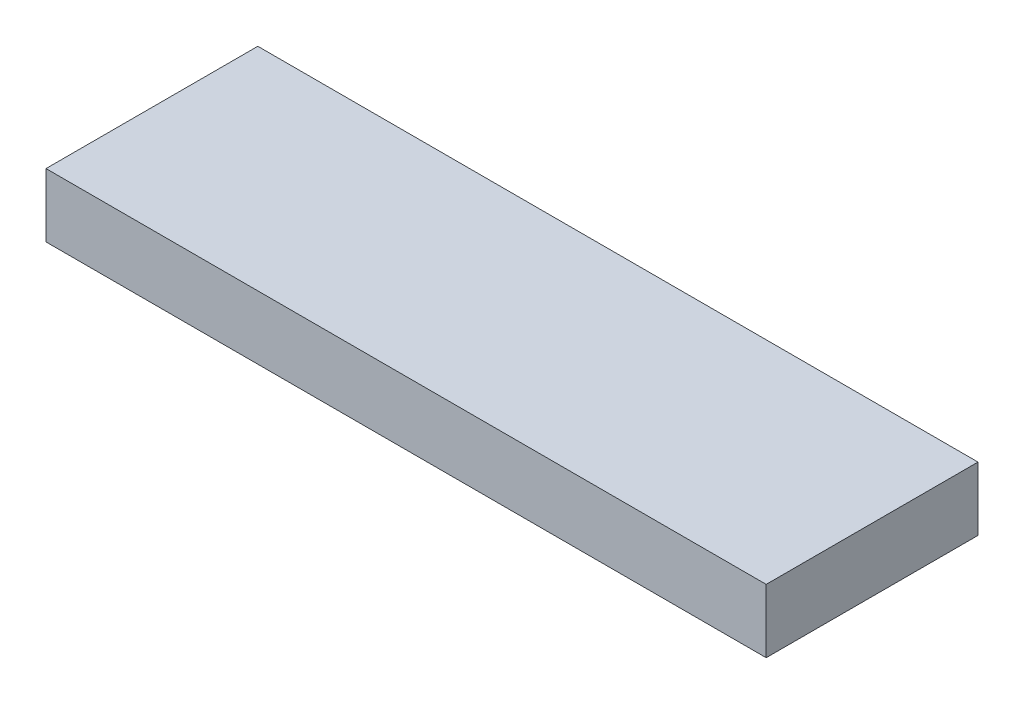
ISO-10303-21;
HEADER;
FILE_DESCRIPTION(('STEP AP214'),'2;1');
FILE_NAME('part.step','',(''),(''),'','','');
FILE_SCHEMA(('AUTOMOTIVE_DESIGN { 1 0 10303 214 1 1 1 1 }'));
ENDSEC;
DATA;
#1=APPLICATION_CONTEXT('core data for automotive mechanical design processes');
#2=APPLICATION_PROTOCOL_DEFINITION('international standard','automotive_design',2000,#1);
#3=PRODUCT_CONTEXT('',#1,'mechanical');
#4=PRODUCT('Part','Part','',(#3));
#5=PRODUCT_RELATED_PRODUCT_CATEGORY('part','',(#4));
#6=PRODUCT_DEFINITION_FORMATION('','',#4);
#7=PRODUCT_DEFINITION_CONTEXT('part definition',#1,'design');
#8=PRODUCT_DEFINITION('design','',#6,#7);
#9=PRODUCT_DEFINITION_SHAPE('','',#8);
#10=(LENGTH_UNIT() NAMED_UNIT(*) SI_UNIT(.MILLI.,.METRE.));
#11=(NAMED_UNIT(*) PLANE_ANGLE_UNIT() SI_UNIT($,.RADIAN.));
#12=(NAMED_UNIT(*) SI_UNIT($,.STERADIAN.) SOLID_ANGLE_UNIT());
#13=UNCERTAINTY_MEASURE_WITH_UNIT(LENGTH_MEASURE(1.E-05),#10,'distance_accuracy_value','');
#14=(GEOMETRIC_REPRESENTATION_CONTEXT(3) GLOBAL_UNCERTAINTY_ASSIGNED_CONTEXT((#13)) GLOBAL_UNIT_ASSIGNED_CONTEXT((#10,
#11,#12)) REPRESENTATION_CONTEXT('',''));
#15=CARTESIAN_POINT('',(0.,0.,0.));
#16=DIRECTION('',(0.,0.,1.));
#17=DIRECTION('',(1.,0.,0.));
#18=AXIS2_PLACEMENT_3D('',#15,#16,#17);
#19=CARTESIAN_POINT('',(17.,3.,5.));
#20=DIRECTION('',(-1.,0.,0.));
#21=DIRECTION('',(0.,0.,1.));
#22=AXIS2_PLACEMENT_3D('',#19,#20,#21);
#23=PLANE('',#22);
#24=DIRECTION('',(0.,0.,-1.));
#25=VECTOR('',#24,1.);
#26=CARTESIAN_POINT('',(17.,0.,5.));
#27=LINE('',#26,#25);
#28=CARTESIAN_POINT('',(17.,0.,5.));
#29=VERTEX_POINT('',#28);
#30=CARTESIAN_POINT('',(17.,0.,-5.));
#31=VERTEX_POINT('',#30);
#32=EDGE_CURVE('E97',#29,#31,#27,.T.);
#33=ORIENTED_EDGE('',*,*,#32,.T.);
#34=DIRECTION('',(0.,-1.,0.));
#35=VECTOR('',#34,1.);
#36=CARTESIAN_POINT('',(17.,3.,-5.));
#37=LINE('',#36,#35);
#38=CARTESIAN_POINT('',(17.,3.,-5.));
#39=VERTEX_POINT('',#38);
#40=EDGE_CURVE('E11',#39,#31,#37,.T.);
#41=ORIENTED_EDGE('',*,*,#40,.F.);
#42=DIRECTION('',(0.,0.,-1.));
#43=VECTOR('',#42,1.);
#44=CARTESIAN_POINT('',(17.,3.,5.));
#45=LINE('',#44,#43);
#46=CARTESIAN_POINT('',(17.,3.,5.));
#47=VERTEX_POINT('',#46);
#48=EDGE_CURVE('E85',#47,#39,#45,.T.);
#49=ORIENTED_EDGE('',*,*,#48,.F.);
#50=DIRECTION('',(0.,-1.,0.));
#51=VECTOR('',#50,1.);
#52=CARTESIAN_POINT('',(17.,3.,5.));
#53=LINE('',#52,#51);
#54=EDGE_CURVE('E93',#47,#29,#53,.T.);
#55=ORIENTED_EDGE('',*,*,#54,.T.);
#56=EDGE_LOOP('',(#33,#41,#49,#55));
#57=FACE_BOUND('',#56,.T.);
#58=ADVANCED_FACE('F34',(#57),#23,.F.);
#59=CARTESIAN_POINT('',(-17.,3.,-4.99999999999999));
#60=DIRECTION('',(0.,0.,1.));
#61=DIRECTION('',(1.,0.,0.));
#62=AXIS2_PLACEMENT_3D('',#59,#60,#61);
#63=PLANE('',#62);
#64=DIRECTION('',(-1.,0.,0.));
#65=VECTOR('',#64,1.);
#66=CARTESIAN_POINT('',(-17.,0.,-4.99999999999999));
#67=LINE('',#66,#65);
#68=CARTESIAN_POINT('',(-17.,0.,-4.99999999999999));
#69=VERTEX_POINT('',#68);
#70=EDGE_CURVE('E89',#31,#69,#67,.T.);
#71=ORIENTED_EDGE('',*,*,#70,.T.);
#72=DIRECTION('',(0.,-1.,0.));
#73=VECTOR('',#72,1.);
#74=CARTESIAN_POINT('',(-17.,3.,-4.99999999999999));
#75=LINE('',#74,#73);
#76=CARTESIAN_POINT('',(-17.,3.,-4.99999999999999));
#77=VERTEX_POINT('',#76);
#78=EDGE_CURVE('E42',#77,#69,#75,.T.);
#79=ORIENTED_EDGE('',*,*,#78,.F.);
#80=DIRECTION('',(-1.,0.,0.));
#81=VECTOR('',#80,1.);
#82=CARTESIAN_POINT('',(-17.,3.,-4.99999999999999));
#83=LINE('',#82,#81);
#84=EDGE_CURVE('E80',#39,#77,#83,.T.);
#85=ORIENTED_EDGE('',*,*,#84,.F.);
#86=ORIENTED_EDGE('',*,*,#40,.T.);
#87=EDGE_LOOP('',(#71,#79,#85,#86));
#88=FACE_BOUND('',#87,.T.);
#89=ADVANCED_FACE('F88',(#88),#63,.F.);
#90=CARTESIAN_POINT('',(-17.,3.,5.));
#91=DIRECTION('',(1.,0.,0.));
#92=DIRECTION('',(0.,0.,-1.));
#93=AXIS2_PLACEMENT_3D('',#90,#91,#92);
#94=PLANE('',#93);
#95=DIRECTION('',(0.,0.,1.));
#96=VECTOR('',#95,1.);
#97=CARTESIAN_POINT('',(-17.,0.,5.));
#98=LINE('',#97,#96);
#99=CARTESIAN_POINT('',(-17.,0.,5.));
#100=VERTEX_POINT('',#99);
#101=EDGE_CURVE('E67',#69,#100,#98,.T.);
#102=ORIENTED_EDGE('',*,*,#101,.T.);
#103=DIRECTION('',(0.,-1.,0.));
#104=VECTOR('',#103,1.);
#105=CARTESIAN_POINT('',(-17.,3.,5.));
#106=LINE('',#105,#104);
#107=CARTESIAN_POINT('',(-17.,3.,5.));
#108=VERTEX_POINT('',#107);
#109=EDGE_CURVE('E90',#108,#100,#106,.T.);
#110=ORIENTED_EDGE('',*,*,#109,.F.);
#111=DIRECTION('',(0.,0.,1.));
#112=VECTOR('',#111,1.);
#113=CARTESIAN_POINT('',(-17.,3.,5.));
#114=LINE('',#113,#112);
#115=EDGE_CURVE('E83',#77,#108,#114,.T.);
#116=ORIENTED_EDGE('',*,*,#115,.F.);
#117=ORIENTED_EDGE('',*,*,#78,.T.);
#118=EDGE_LOOP('',(#102,#110,#116,#117));
#119=FACE_BOUND('',#118,.T.);
#120=ADVANCED_FACE('F91',(#119),#94,.F.);
#121=CARTESIAN_POINT('',(-17.,3.,5.));
#122=DIRECTION('',(0.,0.,-1.));
#123=DIRECTION('',(-1.,0.,0.));
#124=AXIS2_PLACEMENT_3D('',#121,#122,#123);
#125=PLANE('',#124);
#126=DIRECTION('',(1.,0.,0.));
#127=VECTOR('',#126,1.);
#128=CARTESIAN_POINT('',(-17.,0.,5.));
#129=LINE('',#128,#127);
#130=EDGE_CURVE('E73',#100,#29,#129,.T.);
#131=ORIENTED_EDGE('',*,*,#130,.T.);
#132=ORIENTED_EDGE('',*,*,#54,.F.);
#133=DIRECTION('',(1.,0.,0.));
#134=VECTOR('',#133,1.);
#135=CARTESIAN_POINT('',(-17.,3.,5.));
#136=LINE('',#135,#134);
#137=EDGE_CURVE('E50',#108,#47,#136,.T.);
#138=ORIENTED_EDGE('',*,*,#137,.F.);
#139=ORIENTED_EDGE('',*,*,#109,.T.);
#140=EDGE_LOOP('',(#131,#132,#138,#139));
#141=FACE_BOUND('',#140,.T.);
#142=ADVANCED_FACE('F104',(#141),#125,.F.);
#143=CARTESIAN_POINT('',(0.,3.,0.));
#144=DIRECTION('',(0.,-1.,0.));
#145=DIRECTION('',(0.,0.,-1.));
#146=AXIS2_PLACEMENT_3D('',#143,#144,#145);
#147=PLANE('',#146);
#148=ORIENTED_EDGE('',*,*,#48,.T.);
#149=ORIENTED_EDGE('',*,*,#84,.T.);
#150=ORIENTED_EDGE('',*,*,#115,.T.);
#151=ORIENTED_EDGE('',*,*,#137,.T.);
#152=EDGE_LOOP('',(#148,#149,#150,#151));
#153=FACE_BOUND('',#152,.T.);
#154=ADVANCED_FACE('F81',(#153),#147,.F.);
#155=CARTESIAN_POINT('',(0.,0.,0.));
#156=DIRECTION('',(0.,-1.,0.));
#157=DIRECTION('',(0.,0.,-1.));
#158=AXIS2_PLACEMENT_3D('',#155,#156,#157);
#159=PLANE('',#158);
#160=ORIENTED_EDGE('',*,*,#32,.F.);
#161=ORIENTED_EDGE('',*,*,#130,.F.);
#162=ORIENTED_EDGE('',*,*,#101,.F.);
#163=ORIENTED_EDGE('',*,*,#70,.F.);
#164=EDGE_LOOP('',(#160,#161,#162,#163));
#165=FACE_BOUND('',#164,.T.);
#166=ADVANCED_FACE('F107',(#165),#159,.T.);
#167=CLOSED_SHELL('',(#58,#89,#120,#142,#154,#166));
#168=MANIFOLD_SOLID_BREP('B2',#167);
#169=ADVANCED_BREP_SHAPE_REPRESENTATION('',(#18,#168),#14);
#170=SHAPE_DEFINITION_REPRESENTATION(#9,#169);
ENDSEC;
END-ISO-10303-21;
